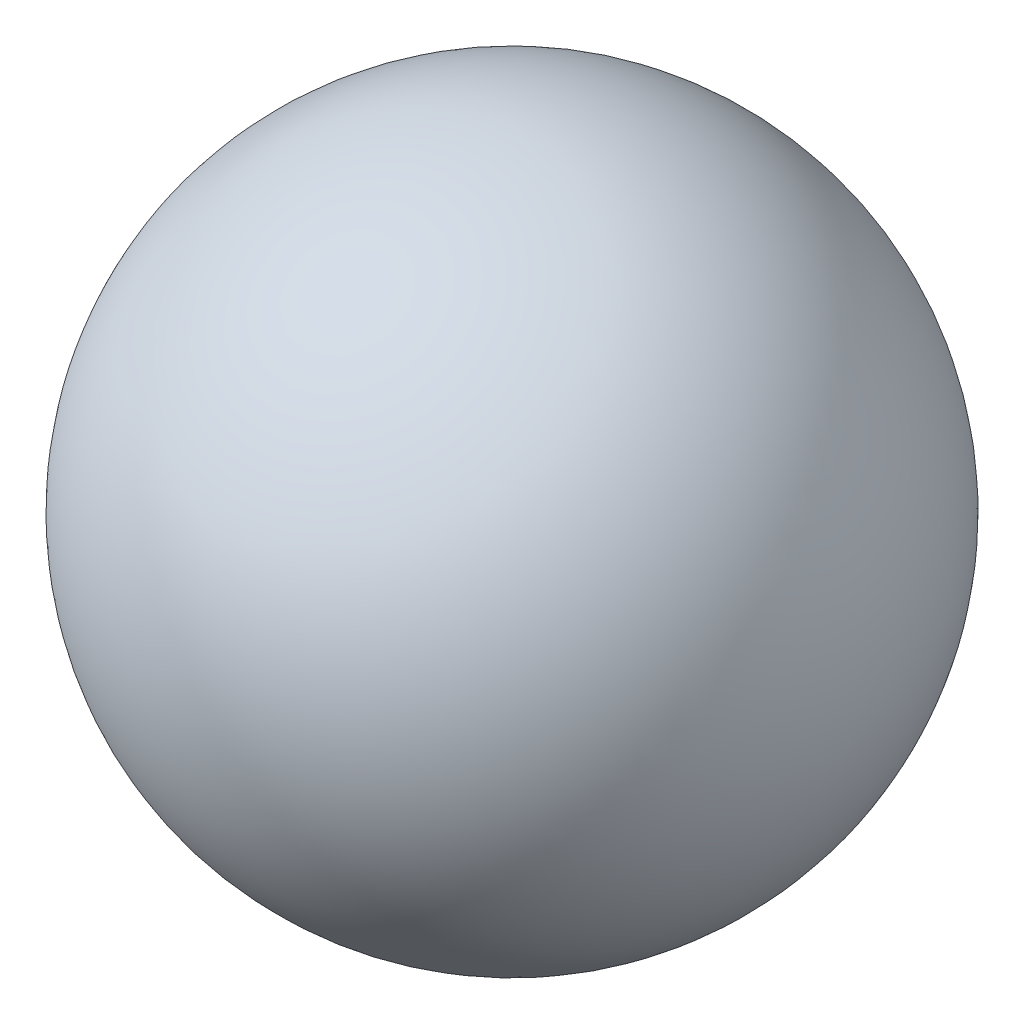
ISO-10303-21;
HEADER;
FILE_DESCRIPTION(('STEP AP214'),'2;1');
FILE_NAME('part.step','',(''),(''),'','','');
FILE_SCHEMA(('AUTOMOTIVE_DESIGN { 1 0 10303 214 1 1 1 1 }'));
ENDSEC;
DATA;
#1=APPLICATION_CONTEXT('core data for automotive mechanical design processes');
#2=APPLICATION_PROTOCOL_DEFINITION('international standard','automotive_design',2000,#1);
#3=PRODUCT_CONTEXT('',#1,'mechanical');
#4=PRODUCT('Part','Part','',(#3));
#5=PRODUCT_RELATED_PRODUCT_CATEGORY('part','',(#4));
#6=PRODUCT_DEFINITION_FORMATION('','',#4);
#7=PRODUCT_DEFINITION_CONTEXT('part definition',#1,'design');
#8=PRODUCT_DEFINITION('design','',#6,#7);
#9=PRODUCT_DEFINITION_SHAPE('','',#8);
#10=(LENGTH_UNIT() NAMED_UNIT(*) SI_UNIT(.MILLI.,.METRE.));
#11=(NAMED_UNIT(*) PLANE_ANGLE_UNIT() SI_UNIT($,.RADIAN.));
#12=(NAMED_UNIT(*) SI_UNIT($,.STERADIAN.) SOLID_ANGLE_UNIT());
#13=UNCERTAINTY_MEASURE_WITH_UNIT(LENGTH_MEASURE(1.E-05),#10,'distance_accuracy_value','');
#14=(GEOMETRIC_REPRESENTATION_CONTEXT(3) GLOBAL_UNCERTAINTY_ASSIGNED_CONTEXT((#13)) GLOBAL_UNIT_ASSIGNED_CONTEXT((#10,
#11,#12)) REPRESENTATION_CONTEXT('',''));
#15=CARTESIAN_POINT('',(0.,0.,0.));
#16=DIRECTION('',(0.,0.,1.));
#17=DIRECTION('',(1.,0.,0.));
#18=AXIS2_PLACEMENT_3D('',#15,#16,#17);
#19=CARTESIAN_POINT('',(0.,0.,0.));
#20=DIRECTION('',(-1.,0.,0.));
#21=DIRECTION('',(0.,0.,-1.));
#22=AXIS2_PLACEMENT_3D('',#19,#20,#21);
#23=SPHERICAL_SURFACE('',#22,2.25);
#24=CARTESIAN_POINT('',(-2.25,0.,0.));
#25=VERTEX_POINT('',#24);
#26=VERTEX_LOOP('',#25);
#27=FACE_BOUND('',#26,.T.);
#28=ADVANCED_FACE('F31',(#27),#23,.T.);
#29=CLOSED_SHELL('',(#28));
#30=MANIFOLD_SOLID_BREP('B2',#29);
#31=ADVANCED_BREP_SHAPE_REPRESENTATION('',(#18,#30),#14);
#32=SHAPE_DEFINITION_REPRESENTATION(#9,#31);
ENDSEC;
END-ISO-10303-21;
